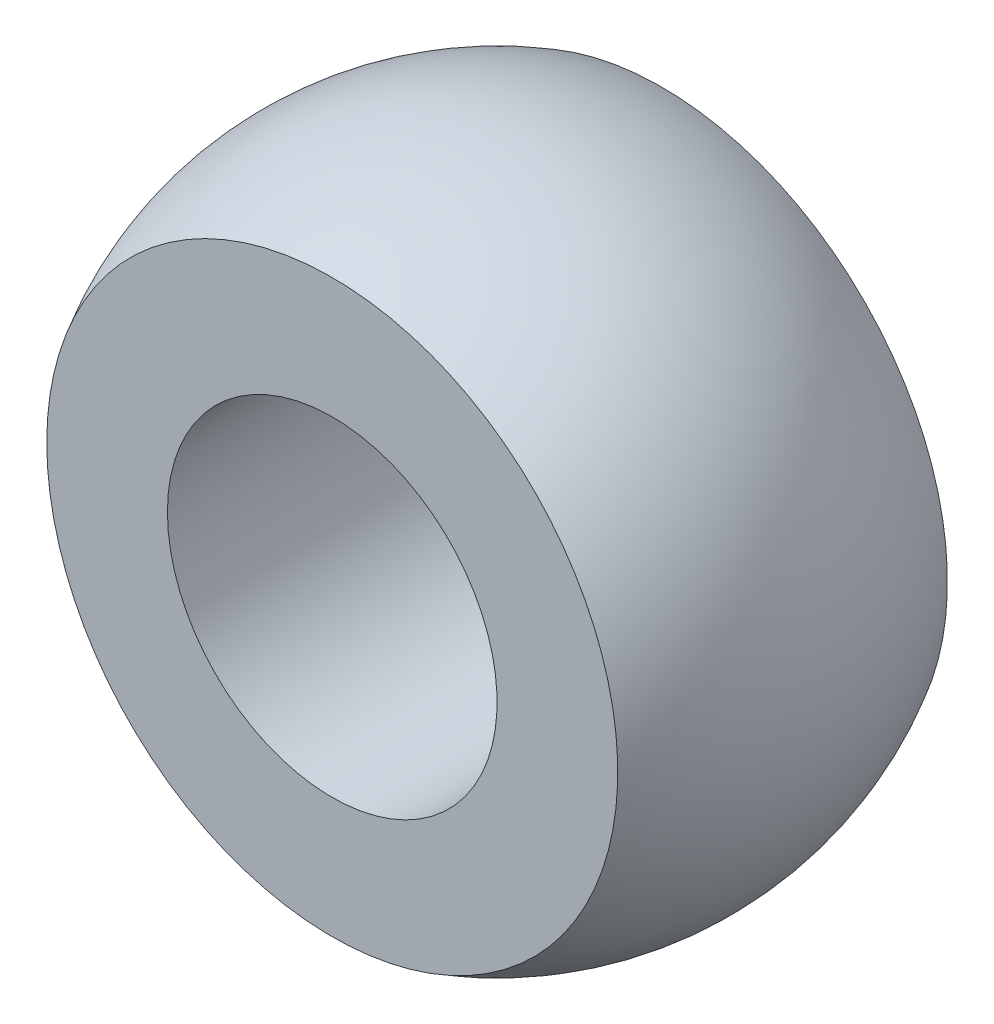
ISO-10303-21;
HEADER;
FILE_DESCRIPTION(('STEP AP214'),'2;1');
FILE_NAME('part.step','',(''),(''),'','','');
FILE_SCHEMA(('AUTOMOTIVE_DESIGN { 1 0 10303 214 1 1 1 1 }'));
ENDSEC;
DATA;
#1=APPLICATION_CONTEXT('core data for automotive mechanical design processes');
#2=APPLICATION_PROTOCOL_DEFINITION('international standard','automotive_design',2000,#1);
#3=PRODUCT_CONTEXT('',#1,'mechanical');
#4=PRODUCT('Part','Part','',(#3));
#5=PRODUCT_RELATED_PRODUCT_CATEGORY('part','',(#4));
#6=PRODUCT_DEFINITION_FORMATION('','',#4);
#7=PRODUCT_DEFINITION_CONTEXT('part definition',#1,'design');
#8=PRODUCT_DEFINITION('design','',#6,#7);
#9=PRODUCT_DEFINITION_SHAPE('','',#8);
#10=(LENGTH_UNIT() NAMED_UNIT(*) SI_UNIT(.MILLI.,.METRE.));
#11=(NAMED_UNIT(*) PLANE_ANGLE_UNIT() SI_UNIT($,.RADIAN.));
#12=(NAMED_UNIT(*) SI_UNIT($,.STERADIAN.) SOLID_ANGLE_UNIT());
#13=UNCERTAINTY_MEASURE_WITH_UNIT(LENGTH_MEASURE(1.E-05),#10,'distance_accuracy_value','');
#14=(GEOMETRIC_REPRESENTATION_CONTEXT(3) GLOBAL_UNCERTAINTY_ASSIGNED_CONTEXT((#13)) GLOBAL_UNIT_ASSIGNED_CONTEXT((#10,
#11,#12)) REPRESENTATION_CONTEXT('',''));
#15=CARTESIAN_POINT('',(0.,0.,0.));
#16=DIRECTION('',(0.,0.,1.));
#17=DIRECTION('',(1.,0.,0.));
#18=AXIS2_PLACEMENT_3D('',#15,#16,#17);
#19=CARTESIAN_POINT('',(0.,0.,-3.));
#20=DIRECTION('',(0.,0.,-1.));
#21=DIRECTION('',(-1.,0.,0.));
#22=AXIS2_PLACEMENT_3D('',#19,#20,#21);
#23=PLANE('',#22);
#24=CARTESIAN_POINT('',(0.,0.,-3.));
#25=DIRECTION('',(0.,0.,-1.));
#26=DIRECTION('',(-1.,0.,0.));
#27=AXIS2_PLACEMENT_3D('',#24,#25,#26);
#28=CIRCLE('',#27,3.);
#29=CARTESIAN_POINT('',(-3.,0.,-3.));
#30=VERTEX_POINT('',#29);
#31=EDGE_CURVE('E49',#30,#30,#28,.T.);
#32=ORIENTED_EDGE('',*,*,#31,.F.);
#33=EDGE_LOOP('',(#32));
#34=FACE_BOUND('',#33,.T.);
#35=CARTESIAN_POINT('',(0.,0.,-3.));
#36=DIRECTION('',(0.,0.,-1.));
#37=DIRECTION('',(-1.,0.,0.));
#38=AXIS2_PLACEMENT_3D('',#35,#36,#37);
#39=CIRCLE('',#38,5.19615242270663);
#40=CARTESIAN_POINT('',(-5.19615242270663,0.,-3.));
#41=VERTEX_POINT('',#40);
#42=EDGE_CURVE('E10',#41,#41,#39,.T.);
#43=ORIENTED_EDGE('',*,*,#42,.T.);
#44=EDGE_LOOP('',(#43));
#45=FACE_BOUND('',#44,.T.);
#46=ADVANCED_FACE('F35',(#34,#45),#23,.T.);
#47=CARTESIAN_POINT('',(0.,0.,0.));
#48=DIRECTION('',(0.,0.,-1.));
#49=DIRECTION('',(-1.,0.,0.));
#50=AXIS2_PLACEMENT_3D('',#47,#48,#49);
#51=SPHERICAL_SURFACE('',#50,6.);
#52=CARTESIAN_POINT('',(0.,0.,3.));
#53=DIRECTION('',(0.,0.,-1.));
#54=DIRECTION('',(-1.,0.,0.));
#55=AXIS2_PLACEMENT_3D('',#52,#53,#54);
#56=CIRCLE('',#55,5.19615242270663);
#57=CARTESIAN_POINT('',(-5.19615242270663,0.,3.));
#58=VERTEX_POINT('',#57);
#59=EDGE_CURVE('E41',#58,#58,#56,.T.);
#60=CARTESIAN_POINT('',(-5.19615242270663,0.,3.));
#61=CARTESIAN_POINT('',(-5.2288777092016,0.,2.94331896437861));
#62=CARTESIAN_POINT('',(-5.26067483933566,0.,2.88610208438379));
#63=CARTESIAN_POINT('',(-5.32238033284461,0.,2.77065875752818));
#64=CARTESIAN_POINT('',(-5.3522886962195,0.,2.71243231066738));
#65=CARTESIAN_POINT('',(-5.41018420217276,0.,2.59503197196064));
#66=CARTESIAN_POINT('',(-5.43817134475113,0.,2.5358580801147));
#67=CARTESIAN_POINT('',(-5.49219455430298,0.,2.41662627753804));
#68=CARTESIAN_POINT('',(-5.51823062127645,0.,2.35656836680733));
#69=CARTESIAN_POINT('',(-5.56832376885899,0.,2.23563282157375));
#70=CARTESIAN_POINT('',(-5.59238084946807,0.,2.1747551870709));
#71=CARTESIAN_POINT('',(-5.63849027161984,0.,2.05224538798391));
#72=CARTESIAN_POINT('',(-5.66054261316255,0.,1.99061322339978));
#73=CARTESIAN_POINT('',(-5.70261894077871,0.,1.86666036023816));
#74=CARTESIAN_POINT('',(-5.72264292685217,0.,1.80433966166067));
#75=CARTESIAN_POINT('',(-5.76064110193434,0.,1.67907646539288));
#76=CARTESIAN_POINT('',(-5.77861529094305,0.,1.61613396770258));
#77=CARTESIAN_POINT('',(-5.81249462452577,0.,1.48969457352767));
#78=CARTESIAN_POINT('',(-5.82839976909977,0.,1.42619767704307));
#79=CARTESIAN_POINT('',(-5.85812398222824,0.,1.29871747936941));
#80=CARTESIAN_POINT('',(-5.87194305078272,0.,1.23473417818034));
#81=CARTESIAN_POINT('',(-5.89748031405605,0.,1.1063496860132));
#82=CARTESIAN_POINT('',(-5.90919850877491,0.,1.04194849503512));
#83=CARTESIAN_POINT('',(-5.93052147624364,0.,0.912797185699947));
#84=CARTESIAN_POINT('',(-5.94012624899351,0.,0.848047067342854));
#85=CARTESIAN_POINT('',(-5.95721208749222,0.,0.718267239297768));
#86=CARTESIAN_POINT('',(-5.96469315324105,0.,0.653237529609774));
#87=CARTESIAN_POINT('',(-5.97752356682531,0.,0.522968154344956));
#88=CARTESIAN_POINT('',(-5.98287291466075,0.,0.45772848876813));
#89=CARTESIAN_POINT('',(-5.9914341642025,0.,0.32710906199359));
#90=CARTESIAN_POINT('',(-5.99464606590882,0.,0.261729300795875));
#91=CARTESIAN_POINT('',(-5.99892898380757,0.,0.130899693065441));
#92=CARTESIAN_POINT('',(-6.,0.,0.0654498465327212));
#93=CARTESIAN_POINT('',(-6.,0.,-0.0654498465327185));
#94=CARTESIAN_POINT('',(-5.99892898380757,0.,-0.130899693065438));
#95=CARTESIAN_POINT('',(-5.99464606590882,0.,-0.261729300795872));
#96=CARTESIAN_POINT('',(-5.9914341642025,0.,-0.327109061993587));
#97=CARTESIAN_POINT('',(-5.98287291466075,0.,-0.457728488768127));
#98=CARTESIAN_POINT('',(-5.97752356682531,0.,-0.522968154344953));
#99=CARTESIAN_POINT('',(-5.96469315324105,0.,-0.653237529609772));
#100=CARTESIAN_POINT('',(-5.95721208749222,0.,-0.718267239297765));
#101=CARTESIAN_POINT('',(-5.94012624899351,0.,-0.848047067342851));
#102=CARTESIAN_POINT('',(-5.93052147624364,0.,-0.912797185699945));
#103=CARTESIAN_POINT('',(-5.90919850877491,0.,-1.04194849503512));
#104=CARTESIAN_POINT('',(-5.89748031405605,0.,-1.1063496860132));
#105=CARTESIAN_POINT('',(-5.87194305078272,0.,-1.23473417818034));
#106=CARTESIAN_POINT('',(-5.85812398222824,0.,-1.29871747936941));
#107=CARTESIAN_POINT('',(-5.82839976909977,0.,-1.42619767704307));
#108=CARTESIAN_POINT('',(-5.81249462452577,0.,-1.48969457352767));
#109=CARTESIAN_POINT('',(-5.77861529094305,0.,-1.61613396770257));
#110=CARTESIAN_POINT('',(-5.76064110193434,0.,-1.67907646539288));
#111=CARTESIAN_POINT('',(-5.72264292685217,0.,-1.80433966166067));
#112=CARTESIAN_POINT('',(-5.70261894077872,0.,-1.86666036023816));
#113=CARTESIAN_POINT('',(-5.66054261316255,0.,-1.99061322339978));
#114=CARTESIAN_POINT('',(-5.63849027161985,0.,-2.05224538798391));
#115=CARTESIAN_POINT('',(-5.59238084946807,0.,-2.17475518707089));
#116=CARTESIAN_POINT('',(-5.56832376885899,0.,-2.23563282157375));
#117=CARTESIAN_POINT('',(-5.51823062127645,0.,-2.35656836680732));
#118=CARTESIAN_POINT('',(-5.49219455430298,0.,-2.41662627753804));
#119=CARTESIAN_POINT('',(-5.43817134475113,0.,-2.5358580801147));
#120=CARTESIAN_POINT('',(-5.41018420217276,0.,-2.59503197196064));
#121=CARTESIAN_POINT('',(-5.3522886962195,0.,-2.71243231066738));
#122=CARTESIAN_POINT('',(-5.32238033284461,0.,-2.77065875752818));
#123=CARTESIAN_POINT('',(-5.26067483933566,0.,-2.88610208438379));
#124=CARTESIAN_POINT('',(-5.2288777092016,0.,-2.9433189643786));
#125=CARTESIAN_POINT('',(-5.19615242270663,0.,-3.));
#126=B_SPLINE_CURVE_WITH_KNOTS('',3,(#60,#61,#62,#63,#64,#65,#66,#67,#68,#69,#70,#71,#72,#73,
#74,#75,#76,#77,#78,#79,#80,#81,#82,#83,#84,#85,#86,#87,#88,#89,#90,#91,#92,#93,#94,#95,#96,#97,
#98,#99,#100,#101,#102,#103,#104,#105,#106,#107,#108,#109,#110,#111,#112,#113,#114,#115,#116,
#117,#118,#119,#120,#121,#122,#123,#124,#125),.UNSPECIFIED.,.F.,.F.,(4,2,2,2,2,2,2,2,2,2,2,2,2,
2,2,2,2,2,2,2,2,2,2,2,2,2,2,2,2,2,2,2,4),(0.,0.196340779517841,0.392681559035682,
0.589022338553524,0.785363118071365,0.981703897589206,1.17804467710705,1.37438545662489,
1.57072623614273,1.76706701566057,1.96340779517841,2.15974857469626,2.3560893542141,
2.55243013373194,2.74877091324978,2.94511169276762,3.14145247228546,3.3377932518033,
3.53413403132114,3.73047481083898,3.92681559035683,4.12315636987467,4.31949714939251,
4.51583792891035,4.71217870842819,4.90851948794603,5.10486026746387,5.30120104698172,
5.49754182649956,5.6938826060174,5.89022338553524,6.08656416505308,6.28290494457092),.UNSPECIFIED.);
#127=EDGE_CURVE('BSEAM58',#58,#41,#126,.T.);
#128=ORIENTED_EDGE('',*,*,#59,.T.);
#129=ORIENTED_EDGE('',*,*,#42,.F.);
#130=ORIENTED_EDGE('',*,*,#127,.T.);
#131=ORIENTED_EDGE('',*,*,#127,.F.);
#132=EDGE_LOOP('',(#128,#130,#129,#131));
#133=FACE_BOUND('',#132,.T.);
#134=ADVANCED_FACE('F58',(#133),#51,.T.);
#135=CARTESIAN_POINT('',(0.,0.,3.));
#136=DIRECTION('',(0.,0.,-1.));
#137=DIRECTION('',(-1.,0.,0.));
#138=AXIS2_PLACEMENT_3D('',#135,#136,#137);
#139=PLANE('',#138);
#140=CARTESIAN_POINT('',(0.,0.,3.));
#141=DIRECTION('',(0.,0.,-1.));
#142=DIRECTION('',(-1.,0.,0.));
#143=AXIS2_PLACEMENT_3D('',#140,#141,#142);
#144=CIRCLE('',#143,3.);
#145=CARTESIAN_POINT('',(-3.,0.,3.));
#146=VERTEX_POINT('',#145);
#147=EDGE_CURVE('E45',#146,#146,#144,.T.);
#148=ORIENTED_EDGE('',*,*,#147,.T.);
#149=EDGE_LOOP('',(#148));
#150=FACE_BOUND('',#149,.T.);
#151=ORIENTED_EDGE('',*,*,#59,.F.);
#152=EDGE_LOOP('',(#151));
#153=FACE_BOUND('',#152,.T.);
#154=ADVANCED_FACE('F62',(#150,#153),#139,.F.);
#155=CARTESIAN_POINT('',(0.,0.,3.));
#156=DIRECTION('',(0.,0.,-1.));
#157=DIRECTION('',(-1.,0.,0.));
#158=AXIS2_PLACEMENT_3D('',#155,#156,#157);
#159=CYLINDRICAL_SURFACE('',#158,3.);
#160=ORIENTED_EDGE('',*,*,#147,.F.);
#161=EDGE_LOOP('',(#160));
#162=FACE_BOUND('',#161,.T.);
#163=ORIENTED_EDGE('',*,*,#31,.T.);
#164=EDGE_LOOP('',(#163));
#165=FACE_BOUND('',#164,.T.);
#166=ADVANCED_FACE('F55',(#162,#165),#159,.F.);
#167=CLOSED_SHELL('',(#46,#134,#154,#166));
#168=MANIFOLD_SOLID_BREP('B2',#167);
#169=ADVANCED_BREP_SHAPE_REPRESENTATION('',(#18,#168),#14);
#170=SHAPE_DEFINITION_REPRESENTATION(#9,#169);
ENDSEC;
END-ISO-10303-21;
